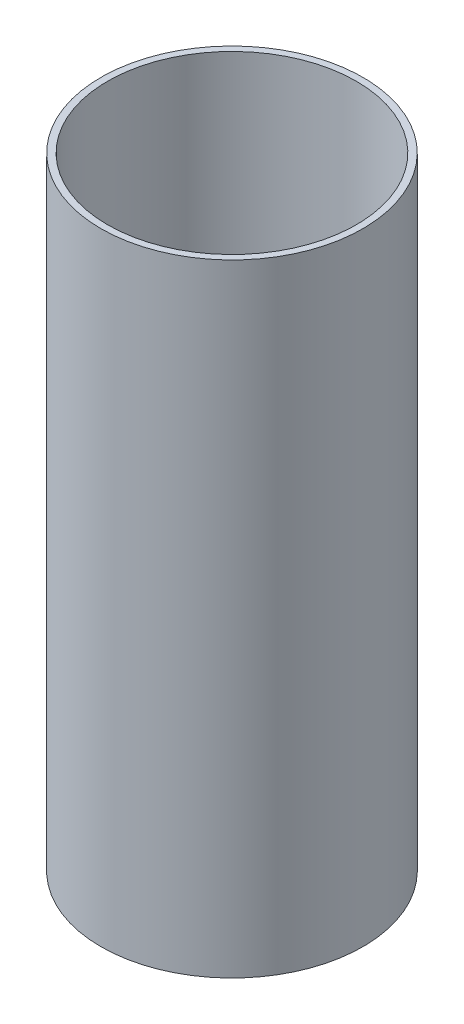
ISO-10303-21;
HEADER;
FILE_DESCRIPTION(('STEP AP214'),'2;1');
FILE_NAME('part.step','',(''),(''),'','','');
FILE_SCHEMA(('AUTOMOTIVE_DESIGN { 1 0 10303 214 1 1 1 1 }'));
ENDSEC;
DATA;
#1=APPLICATION_CONTEXT('core data for automotive mechanical design processes');
#2=APPLICATION_PROTOCOL_DEFINITION('international standard','automotive_design',2000,#1);
#3=PRODUCT_CONTEXT('',#1,'mechanical');
#4=PRODUCT('Part','Part','',(#3));
#5=PRODUCT_RELATED_PRODUCT_CATEGORY('part','',(#4));
#6=PRODUCT_DEFINITION_FORMATION('','',#4);
#7=PRODUCT_DEFINITION_CONTEXT('part definition',#1,'design');
#8=PRODUCT_DEFINITION('design','',#6,#7);
#9=PRODUCT_DEFINITION_SHAPE('','',#8);
#10=(LENGTH_UNIT() NAMED_UNIT(*) SI_UNIT(.MILLI.,.METRE.));
#11=(NAMED_UNIT(*) PLANE_ANGLE_UNIT() SI_UNIT($,.RADIAN.));
#12=(NAMED_UNIT(*) SI_UNIT($,.STERADIAN.) SOLID_ANGLE_UNIT());
#13=UNCERTAINTY_MEASURE_WITH_UNIT(LENGTH_MEASURE(1.E-05),#10,'distance_accuracy_value','');
#14=(GEOMETRIC_REPRESENTATION_CONTEXT(3) GLOBAL_UNCERTAINTY_ASSIGNED_CONTEXT((#13)) GLOBAL_UNIT_ASSIGNED_CONTEXT((#10,
#11,#12)) REPRESENTATION_CONTEXT('',''));
#15=CARTESIAN_POINT('',(0.,0.,0.));
#16=DIRECTION('',(0.,0.,1.));
#17=DIRECTION('',(1.,0.,0.));
#18=AXIS2_PLACEMENT_3D('',#15,#16,#17);
#19=CARTESIAN_POINT('',(0.,222.25,0.));
#20=DIRECTION('',(0.,1.,0.));
#21=DIRECTION('',(0.,0.,1.));
#22=AXIS2_PLACEMENT_3D('',#19,#20,#21);
#23=PLANE('',#22);
#24=CARTESIAN_POINT('',(0.,222.25,0.));
#25=DIRECTION('',(0.,1.,0.));
#26=DIRECTION('',(0.,0.,1.));
#27=AXIS2_PLACEMENT_3D('',#24,#25,#26);
#28=CIRCLE('',#27,93.6625);
#29=CARTESIAN_POINT('',(0.,222.25,93.6625));
#30=VERTEX_POINT('',#29);
#31=EDGE_CURVE('E10',#30,#30,#28,.T.);
#32=ORIENTED_EDGE('',*,*,#31,.T.);
#33=EDGE_LOOP('',(#32));
#34=FACE_BOUND('',#33,.T.);
#35=CARTESIAN_POINT('',(0.,222.25,0.));
#36=DIRECTION('',(0.,1.,0.));
#37=DIRECTION('',(0.,0.,1.));
#38=AXIS2_PLACEMENT_3D('',#35,#36,#37);
#39=CIRCLE('',#38,88.9);
#40=CARTESIAN_POINT('',(0.,222.25,88.9));
#41=VERTEX_POINT('',#40);
#42=EDGE_CURVE('E54',#41,#41,#39,.T.);
#43=ORIENTED_EDGE('',*,*,#42,.F.);
#44=EDGE_LOOP('',(#43));
#45=FACE_BOUND('',#44,.T.);
#46=ADVANCED_FACE('F43',(#34,#45),#23,.T.);
#47=CARTESIAN_POINT('',(0.,-222.25,0.));
#48=DIRECTION('',(0.,1.,0.));
#49=DIRECTION('',(0.,0.,1.));
#50=AXIS2_PLACEMENT_3D('',#47,#48,#49);
#51=PLANE('',#50);
#52=CARTESIAN_POINT('',(0.,-222.25,0.));
#53=DIRECTION('',(0.,1.,0.));
#54=DIRECTION('',(0.,0.,1.));
#55=AXIS2_PLACEMENT_3D('',#52,#53,#54);
#56=CIRCLE('',#55,93.6625);
#57=CARTESIAN_POINT('',(0.,-222.25,93.6625));
#58=VERTEX_POINT('',#57);
#59=EDGE_CURVE('E47',#58,#58,#56,.T.);
#60=ORIENTED_EDGE('',*,*,#59,.F.);
#61=EDGE_LOOP('',(#60));
#62=FACE_BOUND('',#61,.T.);
#63=CARTESIAN_POINT('',(0.,-222.25,0.));
#64=DIRECTION('',(0.,1.,0.));
#65=DIRECTION('',(0.,0.,1.));
#66=AXIS2_PLACEMENT_3D('',#63,#64,#65);
#67=CIRCLE('',#66,88.9);
#68=CARTESIAN_POINT('',(0.,-222.25,88.9));
#69=VERTEX_POINT('',#68);
#70=EDGE_CURVE('E56',#69,#69,#67,.T.);
#71=ORIENTED_EDGE('',*,*,#70,.T.);
#72=EDGE_LOOP('',(#71));
#73=FACE_BOUND('',#72,.T.);
#74=ADVANCED_FACE('F66',(#62,#73),#51,.F.);
#75=CARTESIAN_POINT('',(0.,222.25,0.));
#76=DIRECTION('',(0.,-1.,0.));
#77=DIRECTION('',(0.,0.,-1.));
#78=AXIS2_PLACEMENT_3D('',#75,#76,#77);
#79=CYLINDRICAL_SURFACE('',#78,93.6625);
#80=ORIENTED_EDGE('',*,*,#31,.F.);
#81=EDGE_LOOP('',(#80));
#82=FACE_BOUND('',#81,.T.);
#83=ORIENTED_EDGE('',*,*,#59,.T.);
#84=EDGE_LOOP('',(#83));
#85=FACE_BOUND('',#84,.T.);
#86=ADVANCED_FACE('F45',(#82,#85),#79,.T.);
#87=CARTESIAN_POINT('',(0.,222.25,0.));
#88=DIRECTION('',(0.,-1.,0.));
#89=DIRECTION('',(0.,0.,-1.));
#90=AXIS2_PLACEMENT_3D('',#87,#88,#89);
#91=CYLINDRICAL_SURFACE('',#90,88.9);
#92=ORIENTED_EDGE('',*,*,#42,.T.);
#93=EDGE_LOOP('',(#92));
#94=FACE_BOUND('',#93,.T.);
#95=ORIENTED_EDGE('',*,*,#70,.F.);
#96=EDGE_LOOP('',(#95));
#97=FACE_BOUND('',#96,.T.);
#98=ADVANCED_FACE('F62',(#94,#97),#91,.F.);
#99=CLOSED_SHELL('',(#46,#74,#86,#98));
#100=MANIFOLD_SOLID_BREP('B2',#99);
#101=ADVANCED_BREP_SHAPE_REPRESENTATION('',(#18,#100),#14);
#102=SHAPE_DEFINITION_REPRESENTATION(#9,#101);
ENDSEC;
END-ISO-10303-21;
